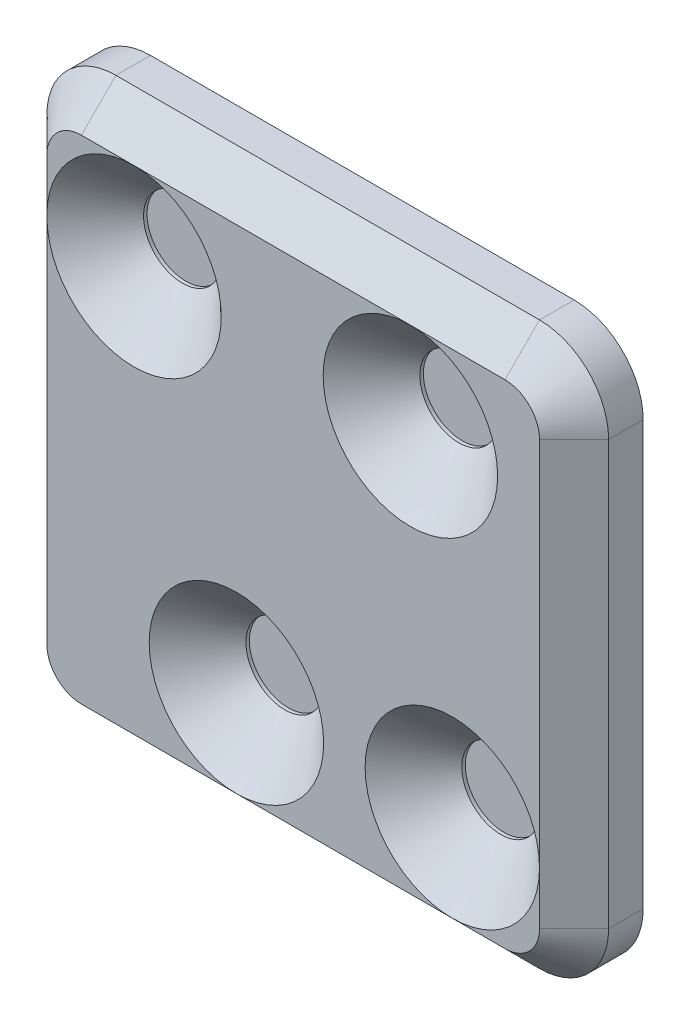
ISO-10303-21;
HEADER;
FILE_DESCRIPTION(('STEP AP214'),'2;1');
FILE_NAME('part.step','',(''),(''),'','','');
FILE_SCHEMA(('AUTOMOTIVE_DESIGN { 1 0 10303 214 1 1 1 1 }'));
ENDSEC;
DATA;
#1=APPLICATION_CONTEXT('core data for automotive mechanical design processes');
#2=APPLICATION_PROTOCOL_DEFINITION('international standard','automotive_design',2000,#1);
#3=PRODUCT_CONTEXT('',#1,'mechanical');
#4=PRODUCT('Part','Part','',(#3));
#5=PRODUCT_RELATED_PRODUCT_CATEGORY('part','',(#4));
#6=PRODUCT_DEFINITION_FORMATION('','',#4);
#7=PRODUCT_DEFINITION_CONTEXT('part definition',#1,'design');
#8=PRODUCT_DEFINITION('design','',#6,#7);
#9=PRODUCT_DEFINITION_SHAPE('','',#8);
#10=(LENGTH_UNIT() NAMED_UNIT(*) SI_UNIT(.MILLI.,.METRE.));
#11=(NAMED_UNIT(*) PLANE_ANGLE_UNIT() SI_UNIT($,.RADIAN.));
#12=(NAMED_UNIT(*) SI_UNIT($,.STERADIAN.) SOLID_ANGLE_UNIT());
#13=UNCERTAINTY_MEASURE_WITH_UNIT(LENGTH_MEASURE(1.E-05),#10,'distance_accuracy_value','');
#14=(GEOMETRIC_REPRESENTATION_CONTEXT(3) GLOBAL_UNCERTAINTY_ASSIGNED_CONTEXT((#13)) GLOBAL_UNIT_ASSIGNED_CONTEXT((#10,
#11,#12)) REPRESENTATION_CONTEXT('',''));
#15=CARTESIAN_POINT('',(0.,0.,0.));
#16=DIRECTION('',(0.,0.,1.));
#17=DIRECTION('',(1.,0.,0.));
#18=AXIS2_PLACEMENT_3D('',#15,#16,#17);
#19=CARTESIAN_POINT('',(0.,0.,4.));
#20=DIRECTION('',(0.,0.,1.));
#21=DIRECTION('',(1.,0.,0.));
#22=AXIS2_PLACEMENT_3D('',#19,#20,#21);
#23=PLANE('',#22);
#24=DIRECTION('',(0.,1.,0.));
#25=VECTOR('',#24,1.);
#26=CARTESIAN_POINT('',(14.2634559672906,12.2634559672906,4.));
#27=LINE('',#26,#25);
#28=CARTESIAN_POINT('',(14.2634559672906,-12.2634559672906,4.));
#29=VERTEX_POINT('',#28);
#30=CARTESIAN_POINT('',(14.2634559672906,-9.21345596729061,4.));
#31=VERTEX_POINT('',#30);
#32=EDGE_CURVE('E213',#29,#31,#27,.T.);
#33=ORIENTED_EDGE('',*,*,#32,.T.);
#34=CARTESIAN_POINT('',(9.21345596729061,-9.21345596729061,4.));
#35=DIRECTION('',(0.,0.,1.));
#36=DIRECTION('',(1.,0.,0.));
#37=AXIS2_PLACEMENT_3D('',#34,#35,#36);
#38=CIRCLE('',#37,5.05000000000002);
#39=CARTESIAN_POINT('',(9.21345596729061,-14.2634559672906,4.));
#40=VERTEX_POINT('',#39);
#41=EDGE_CURVE('E271',#31,#40,#38,.F.);
#42=ORIENTED_EDGE('',*,*,#41,.T.);
#43=DIRECTION('',(1.,0.,0.));
#44=VECTOR('',#43,1.);
#45=CARTESIAN_POINT('',(12.2634559672906,-14.2634559672906,4.));
#46=LINE('',#45,#44);
#47=CARTESIAN_POINT('',(12.2634559672906,-14.2634559672906,4.));
#48=VERTEX_POINT('',#47);
#49=EDGE_CURVE('E220',#40,#48,#46,.T.);
#50=ORIENTED_EDGE('',*,*,#49,.T.);
#51=CARTESIAN_POINT('',(12.2634559672906,-12.2634559672906,4.));
#52=DIRECTION('',(0.,0.,1.));
#53=DIRECTION('',(1.,0.,0.));
#54=AXIS2_PLACEMENT_3D('',#51,#52,#53);
#55=CIRCLE('',#54,2.00000000000001);
#56=EDGE_CURVE('E218',#48,#29,#55,.T.);
#57=ORIENTED_EDGE('',*,*,#56,.T.);
#58=EDGE_LOOP('',(#33,#42,#50,#57));
#59=FACE_BOUND('',#58,.T.);
#60=ADVANCED_FACE('F36',(#59),#23,.T.);
#61=DIRECTION('',(0.,-1.,0.));
#62=VECTOR('',#61,1.);
#63=CARTESIAN_POINT('',(-14.2634559672906,-12.2634559672906,4.));
#64=LINE('',#63,#62);
#65=CARTESIAN_POINT('',(-14.2634559672906,12.2634559672906,4.));
#66=VERTEX_POINT('',#65);
#67=CARTESIAN_POINT('',(-14.2634559672906,9.21345596729061,4.));
#68=VERTEX_POINT('',#67);
#69=EDGE_CURVE('E209',#66,#68,#64,.T.);
#70=ORIENTED_EDGE('',*,*,#69,.T.);
#71=CARTESIAN_POINT('',(-9.21345596729061,9.21345596729061,4.));
#72=DIRECTION('',(0.,0.,1.));
#73=DIRECTION('',(1.,0.,0.));
#74=AXIS2_PLACEMENT_3D('',#71,#72,#73);
#75=CIRCLE('',#74,5.05000000000001);
#76=CARTESIAN_POINT('',(-9.21345596729061,14.2634559672906,4.));
#77=VERTEX_POINT('',#76);
#78=EDGE_CURVE('E267',#68,#77,#75,.F.);
#79=ORIENTED_EDGE('',*,*,#78,.T.);
#80=DIRECTION('',(-1.,0.,0.));
#81=VECTOR('',#80,1.);
#82=CARTESIAN_POINT('',(-12.2634559672906,14.2634559672906,4.));
#83=LINE('',#82,#81);
#84=CARTESIAN_POINT('',(-12.2634559672906,14.2634559672906,4.));
#85=VERTEX_POINT('',#84);
#86=EDGE_CURVE('E199',#77,#85,#83,.T.);
#87=ORIENTED_EDGE('',*,*,#86,.T.);
#88=CARTESIAN_POINT('',(-12.2634559672906,12.2634559672906,4.));
#89=DIRECTION('',(0.,0.,1.));
#90=DIRECTION('',(1.,0.,0.));
#91=AXIS2_PLACEMENT_3D('',#88,#89,#90);
#92=CIRCLE('',#91,2.00000000000001);
#93=EDGE_CURVE('E203',#85,#66,#92,.T.);
#94=ORIENTED_EDGE('',*,*,#93,.T.);
#95=EDGE_LOOP('',(#70,#79,#87,#94));
#96=FACE_BOUND('',#95,.T.);
#97=ADVANCED_FACE('F300',(#96),#23,.T.);
#98=CARTESIAN_POINT('',(-16.2634559672906,-16.2634559672906,4.));
#99=DIRECTION('',(1.,0.,0.));
#100=DIRECTION('',(0.,0.,-1.));
#101=AXIS2_PLACEMENT_3D('',#98,#99,#100);
#102=PLANE('',#101);
#103=DIRECTION('',(0.,0.,-1.));
#104=VECTOR('',#103,1.);
#105=CARTESIAN_POINT('',(-16.2634559672906,-12.2634559672906,4.));
#106=LINE('',#105,#104);
#107=CARTESIAN_POINT('',(-16.2634559672906,-12.2634559672906,0.));
#108=VERTEX_POINT('',#107);
#109=CARTESIAN_POINT('',(-16.2634559672906,-12.2634559672906,2.));
#110=VERTEX_POINT('',#109);
#111=EDGE_CURVE('E160',#108,#110,#106,.F.);
#112=ORIENTED_EDGE('',*,*,#111,.T.);
#113=DIRECTION('',(0.,1.,0.));
#114=VECTOR('',#113,1.);
#115=CARTESIAN_POINT('',(-16.2634559672906,12.2634559672906,2.));
#116=LINE('',#115,#114);
#117=CARTESIAN_POINT('',(-16.2634559672906,12.2634559672906,2.));
#118=VERTEX_POINT('',#117);
#119=EDGE_CURVE('E232',#110,#118,#116,.T.);
#120=ORIENTED_EDGE('',*,*,#119,.T.);
#121=DIRECTION('',(0.,0.,-1.));
#122=VECTOR('',#121,1.);
#123=CARTESIAN_POINT('',(-16.2634559672906,12.2634559672906,4.));
#124=LINE('',#123,#122);
#125=CARTESIAN_POINT('',(-16.2634559672906,12.2634559672906,0.));
#126=VERTEX_POINT('',#125);
#127=EDGE_CURVE('E164',#118,#126,#124,.T.);
#128=ORIENTED_EDGE('',*,*,#127,.T.);
#129=DIRECTION('',(0.,-1.,0.));
#130=VECTOR('',#129,1.);
#131=CARTESIAN_POINT('',(-16.2634559672906,-16.2634559672906,0.));
#132=LINE('',#131,#130);
#133=EDGE_CURVE('E171',#126,#108,#132,.T.);
#134=ORIENTED_EDGE('',*,*,#133,.T.);
#135=EDGE_LOOP('',(#112,#120,#128,#134));
#136=FACE_BOUND('',#135,.T.);
#137=ADVANCED_FACE('F307',(#136),#102,.F.);
#138=CARTESIAN_POINT('',(16.2634559672906,-16.2634559672906,4.));
#139=DIRECTION('',(0.,1.,0.));
#140=DIRECTION('',(-1.,0.,0.));
#141=AXIS2_PLACEMENT_3D('',#138,#139,#140);
#142=PLANE('',#141);
#143=DIRECTION('',(0.,0.,-1.));
#144=VECTOR('',#143,1.);
#145=CARTESIAN_POINT('',(12.2634559672906,-16.2634559672906,4.));
#146=LINE('',#145,#144);
#147=CARTESIAN_POINT('',(12.2634559672906,-16.2634559672906,0.));
#148=VERTEX_POINT('',#147);
#149=CARTESIAN_POINT('',(12.2634559672906,-16.2634559672906,2.));
#150=VERTEX_POINT('',#149);
#151=EDGE_CURVE('E154',#148,#150,#146,.F.);
#152=ORIENTED_EDGE('',*,*,#151,.T.);
#153=DIRECTION('',(-1.,0.,0.));
#154=VECTOR('',#153,1.);
#155=CARTESIAN_POINT('',(-12.2634559672906,-16.2634559672906,2.));
#156=LINE('',#155,#154);
#157=CARTESIAN_POINT('',(-12.2634559672906,-16.2634559672906,2.));
#158=VERTEX_POINT('',#157);
#159=EDGE_CURVE('E151',#150,#158,#156,.T.);
#160=ORIENTED_EDGE('',*,*,#159,.T.);
#161=DIRECTION('',(0.,0.,-1.));
#162=VECTOR('',#161,1.);
#163=CARTESIAN_POINT('',(-12.2634559672906,-16.2634559672906,4.));
#164=LINE('',#163,#162);
#165=CARTESIAN_POINT('',(-12.2634559672906,-16.2634559672906,0.));
#166=VERTEX_POINT('',#165);
#167=EDGE_CURVE('E143',#158,#166,#164,.T.);
#168=ORIENTED_EDGE('',*,*,#167,.T.);
#169=DIRECTION('',(1.,0.,0.));
#170=VECTOR('',#169,1.);
#171=CARTESIAN_POINT('',(16.2634559672906,-16.2634559672906,0.));
#172=LINE('',#171,#170);
#173=EDGE_CURVE('E148',#166,#148,#172,.T.);
#174=ORIENTED_EDGE('',*,*,#173,.T.);
#175=EDGE_LOOP('',(#152,#160,#168,#174));
#176=FACE_BOUND('',#175,.T.);
#177=ADVANCED_FACE('F146',(#176),#142,.F.);
#178=CARTESIAN_POINT('',(16.2634559672906,-16.2634559672906,4.));
#179=DIRECTION('',(-1.,0.,0.));
#180=DIRECTION('',(0.,0.,1.));
#181=AXIS2_PLACEMENT_3D('',#178,#179,#180);
#182=PLANE('',#181);
#183=DIRECTION('',(0.,0.,-1.));
#184=VECTOR('',#183,1.);
#185=CARTESIAN_POINT('',(16.2634559672906,12.2634559672906,4.));
#186=LINE('',#185,#184);
#187=CARTESIAN_POINT('',(16.2634559672906,12.2634559672906,0.));
#188=VERTEX_POINT('',#187);
#189=CARTESIAN_POINT('',(16.2634559672906,12.2634559672906,2.));
#190=VERTEX_POINT('',#189);
#191=EDGE_CURVE('E189',#188,#190,#186,.F.);
#192=ORIENTED_EDGE('',*,*,#191,.T.);
#193=DIRECTION('',(0.,-1.,0.));
#194=VECTOR('',#193,1.);
#195=CARTESIAN_POINT('',(16.2634559672906,-12.2634559672906,2.));
#196=LINE('',#195,#194);
#197=CARTESIAN_POINT('',(16.2634559672906,-12.2634559672906,2.));
#198=VERTEX_POINT('',#197);
#199=EDGE_CURVE('E230',#190,#198,#196,.T.);
#200=ORIENTED_EDGE('',*,*,#199,.T.);
#201=DIRECTION('',(0.,0.,-1.));
#202=VECTOR('',#201,1.);
#203=CARTESIAN_POINT('',(16.2634559672906,-12.2634559672906,4.));
#204=LINE('',#203,#202);
#205=CARTESIAN_POINT('',(16.2634559672906,-12.2634559672906,0.));
#206=VERTEX_POINT('',#205);
#207=EDGE_CURVE('E192',#198,#206,#204,.T.);
#208=ORIENTED_EDGE('',*,*,#207,.T.);
#209=DIRECTION('',(0.,1.,0.));
#210=VECTOR('',#209,1.);
#211=CARTESIAN_POINT('',(16.2634559672906,-16.2634559672906,0.));
#212=LINE('',#211,#210);
#213=EDGE_CURVE('E170',#206,#188,#212,.T.);
#214=ORIENTED_EDGE('',*,*,#213,.T.);
#215=EDGE_LOOP('',(#192,#200,#208,#214));
#216=FACE_BOUND('',#215,.T.);
#217=ADVANCED_FACE('F317',(#216),#182,.F.);
#218=CARTESIAN_POINT('',(16.2634559672906,16.2634559672906,4.));
#219=DIRECTION('',(0.,-1.,0.));
#220=DIRECTION('',(1.,0.,0.));
#221=AXIS2_PLACEMENT_3D('',#218,#219,#220);
#222=PLANE('',#221);
#223=DIRECTION('',(0.,0.,-1.));
#224=VECTOR('',#223,1.);
#225=CARTESIAN_POINT('',(-12.2634559672906,16.2634559672906,4.));
#226=LINE('',#225,#224);
#227=CARTESIAN_POINT('',(-12.2634559672906,16.2634559672906,0.));
#228=VERTEX_POINT('',#227);
#229=CARTESIAN_POINT('',(-12.2634559672906,16.2634559672906,2.));
#230=VERTEX_POINT('',#229);
#231=EDGE_CURVE('E194',#228,#230,#226,.F.);
#232=ORIENTED_EDGE('',*,*,#231,.T.);
#233=DIRECTION('',(1.,0.,0.));
#234=VECTOR('',#233,1.);
#235=CARTESIAN_POINT('',(12.2634559672906,16.2634559672906,2.));
#236=LINE('',#235,#234);
#237=CARTESIAN_POINT('',(12.2634559672906,16.2634559672906,2.));
#238=VERTEX_POINT('',#237);
#239=EDGE_CURVE('E238',#230,#238,#236,.T.);
#240=ORIENTED_EDGE('',*,*,#239,.T.);
#241=DIRECTION('',(0.,0.,-1.));
#242=VECTOR('',#241,1.);
#243=CARTESIAN_POINT('',(12.2634559672906,16.2634559672906,4.));
#244=LINE('',#243,#242);
#245=CARTESIAN_POINT('',(12.2634559672906,16.2634559672906,0.));
#246=VERTEX_POINT('',#245);
#247=EDGE_CURVE('E197',#238,#246,#244,.T.);
#248=ORIENTED_EDGE('',*,*,#247,.T.);
#249=DIRECTION('',(-1.,0.,0.));
#250=VECTOR('',#249,1.);
#251=CARTESIAN_POINT('',(16.2634559672906,16.2634559672906,0.));
#252=LINE('',#251,#250);
#253=EDGE_CURVE('E174',#246,#228,#252,.T.);
#254=ORIENTED_EDGE('',*,*,#253,.T.);
#255=EDGE_LOOP('',(#232,#240,#248,#254));
#256=FACE_BOUND('',#255,.T.);
#257=ADVANCED_FACE('F312',(#256),#222,.F.);
#258=CARTESIAN_POINT('',(12.2634559672906,14.2634559672906,4.));
#259=VERTEX_POINT('',#258);
#260=CARTESIAN_POINT('',(6.78654403270939,14.2634559672906,4.));
#261=VERTEX_POINT('',#260);
#262=EDGE_CURVE('E200',#259,#261,#83,.T.);
#263=ORIENTED_EDGE('',*,*,#262,.T.);
#264=CARTESIAN_POINT('',(6.78654403270939,9.21345596729061,4.));
#265=DIRECTION('',(0.,0.,1.));
#266=DIRECTION('',(1.,0.,0.));
#267=AXIS2_PLACEMENT_3D('',#264,#265,#266);
#268=CIRCLE('',#267,5.05000000000001);
#269=EDGE_CURVE('E277',#261,#261,#268,.F.);
#270=ORIENTED_EDGE('',*,*,#269,.T.);
#271=EDGE_CURVE('E204',#261,#77,#83,.T.);
#272=ORIENTED_EDGE('',*,*,#271,.T.);
#273=CARTESIAN_POINT('',(-9.21345596729061,9.21345596729061,4.));
#274=DIRECTION('',(0.,0.,1.));
#275=DIRECTION('',(1.,0.,0.));
#276=AXIS2_PLACEMENT_3D('',#273,#274,#275);
#277=CIRCLE('',#276,5.05000000000001);
#278=EDGE_CURVE('E51',#77,#68,#277,.F.);
#279=ORIENTED_EDGE('',*,*,#278,.T.);
#280=CARTESIAN_POINT('',(-14.2634559672906,-12.2634559672906,4.));
#281=VERTEX_POINT('',#280);
#282=EDGE_CURVE('E208',#68,#281,#64,.T.);
#283=ORIENTED_EDGE('',*,*,#282,.T.);
#284=CARTESIAN_POINT('',(-12.2634559672906,-12.2634559672906,4.));
#285=DIRECTION('',(0.,0.,1.));
#286=DIRECTION('',(1.,0.,0.));
#287=AXIS2_PLACEMENT_3D('',#284,#285,#286);
#288=CIRCLE('',#287,2.00000000000001);
#289=CARTESIAN_POINT('',(-12.2634559672906,-14.2634559672906,4.));
#290=VERTEX_POINT('',#289);
#291=EDGE_CURVE('E216',#281,#290,#288,.T.);
#292=ORIENTED_EDGE('',*,*,#291,.T.);
#293=CARTESIAN_POINT('',(-3.28654403270939,-14.2634559672906,4.));
#294=VERTEX_POINT('',#293);
#295=EDGE_CURVE('E221',#290,#294,#46,.T.);
#296=ORIENTED_EDGE('',*,*,#295,.T.);
#297=CARTESIAN_POINT('',(-3.28654403270939,-9.21345596729061,4.));
#298=DIRECTION('',(0.,0.,1.));
#299=DIRECTION('',(1.,0.,0.));
#300=AXIS2_PLACEMENT_3D('',#297,#298,#299);
#301=CIRCLE('',#300,5.05000000000001);
#302=EDGE_CURVE('E274',#294,#294,#301,.F.);
#303=ORIENTED_EDGE('',*,*,#302,.T.);
#304=EDGE_CURVE('E224',#294,#40,#46,.T.);
#305=ORIENTED_EDGE('',*,*,#304,.T.);
#306=CARTESIAN_POINT('',(9.21345596729061,-9.21345596729061,4.));
#307=DIRECTION('',(0.,0.,1.));
#308=DIRECTION('',(1.,0.,0.));
#309=AXIS2_PLACEMENT_3D('',#306,#307,#308);
#310=CIRCLE('',#309,5.05000000000002);
#311=EDGE_CURVE('E269',#40,#31,#310,.F.);
#312=ORIENTED_EDGE('',*,*,#311,.T.);
#313=CARTESIAN_POINT('',(14.2634559672906,12.2634559672906,4.));
#314=VERTEX_POINT('',#313);
#315=EDGE_CURVE('E212',#31,#314,#27,.T.);
#316=ORIENTED_EDGE('',*,*,#315,.T.);
#317=CARTESIAN_POINT('',(12.2634559672906,12.2634559672906,4.));
#318=DIRECTION('',(0.,0.,1.));
#319=DIRECTION('',(1.,0.,0.));
#320=AXIS2_PLACEMENT_3D('',#317,#318,#319);
#321=CIRCLE('',#320,2.00000000000001);
#322=EDGE_CURVE('E206',#314,#259,#321,.T.);
#323=ORIENTED_EDGE('',*,*,#322,.T.);
#324=EDGE_LOOP('',(#263,#270,#272,#279,#283,#292,#296,#303,#305,#312,#316,#323));
#325=FACE_BOUND('',#324,.T.);
#326=ADVANCED_FACE('F303',(#325),#23,.T.);
#327=CARTESIAN_POINT('',(0.,0.,0.));
#328=DIRECTION('',(0.,0.,1.));
#329=DIRECTION('',(1.,0.,0.));
#330=AXIS2_PLACEMENT_3D('',#327,#328,#329);
#331=PLANE('',#330);
#332=ORIENTED_EDGE('',*,*,#173,.F.);
#333=CARTESIAN_POINT('',(-12.2634559672906,-12.2634559672906,0.));
#334=DIRECTION('',(0.,0.,1.));
#335=DIRECTION('',(1.,0.,0.));
#336=AXIS2_PLACEMENT_3D('',#333,#334,#335);
#337=CIRCLE('',#336,4.);
#338=EDGE_CURVE('E157',#166,#108,#337,.F.);
#339=ORIENTED_EDGE('',*,*,#338,.T.);
#340=ORIENTED_EDGE('',*,*,#133,.F.);
#341=CARTESIAN_POINT('',(-12.2634559672906,12.2634559672906,0.));
#342=DIRECTION('',(0.,0.,1.));
#343=DIRECTION('',(1.,0.,0.));
#344=AXIS2_PLACEMENT_3D('',#341,#342,#343);
#345=CIRCLE('',#344,4.);
#346=EDGE_CURVE('E153',#126,#228,#345,.F.);
#347=ORIENTED_EDGE('',*,*,#346,.T.);
#348=ORIENTED_EDGE('',*,*,#253,.F.);
#349=CARTESIAN_POINT('',(12.2634559672906,12.2634559672906,0.));
#350=DIRECTION('',(0.,0.,1.));
#351=DIRECTION('',(1.,0.,0.));
#352=AXIS2_PLACEMENT_3D('',#349,#350,#351);
#353=CIRCLE('',#352,4.);
#354=EDGE_CURVE('E184',#246,#188,#353,.F.);
#355=ORIENTED_EDGE('',*,*,#354,.T.);
#356=ORIENTED_EDGE('',*,*,#213,.F.);
#357=CARTESIAN_POINT('',(12.2634559672906,-12.2634559672906,0.));
#358=DIRECTION('',(0.,0.,1.));
#359=DIRECTION('',(1.,0.,0.));
#360=AXIS2_PLACEMENT_3D('',#357,#358,#359);
#361=CIRCLE('',#360,4.);
#362=EDGE_CURVE('E165',#206,#148,#361,.F.);
#363=ORIENTED_EDGE('',*,*,#362,.T.);
#364=EDGE_LOOP('',(#332,#339,#340,#347,#348,#355,#356,#363));
#365=FACE_BOUND('',#364,.T.);
#366=ADVANCED_FACE('F167',(#365),#331,.F.);
#367=CARTESIAN_POINT('',(-12.2634559672906,-12.2634559672906,4.));
#368=DIRECTION('',(0.,0.,-1.));
#369=DIRECTION('',(-1.,0.,0.));
#370=AXIS2_PLACEMENT_3D('',#367,#368,#369);
#371=CYLINDRICAL_SURFACE('',#370,4.);
#372=ORIENTED_EDGE('',*,*,#167,.F.);
#373=CARTESIAN_POINT('',(-12.2634559672906,-12.2634559672906,2.));
#374=DIRECTION('',(0.,0.,1.));
#375=DIRECTION('',(1.,0.,0.));
#376=AXIS2_PLACEMENT_3D('',#373,#374,#375);
#377=CIRCLE('',#376,4.);
#378=EDGE_CURVE('E228',#158,#110,#377,.F.);
#379=ORIENTED_EDGE('',*,*,#378,.T.);
#380=ORIENTED_EDGE('',*,*,#111,.F.);
#381=ORIENTED_EDGE('',*,*,#338,.F.);
#382=EDGE_LOOP('',(#372,#379,#380,#381));
#383=FACE_BOUND('',#382,.T.);
#384=ADVANCED_FACE('F158',(#383),#371,.T.);
#385=CARTESIAN_POINT('',(12.2634559672906,-12.2634559672906,4.));
#386=DIRECTION('',(0.,0.,-1.));
#387=DIRECTION('',(-1.,0.,0.));
#388=AXIS2_PLACEMENT_3D('',#385,#386,#387);
#389=CYLINDRICAL_SURFACE('',#388,4.);
#390=ORIENTED_EDGE('',*,*,#207,.F.);
#391=CARTESIAN_POINT('',(12.2634559672906,-12.2634559672906,2.));
#392=DIRECTION('',(0.,0.,1.));
#393=DIRECTION('',(1.,0.,0.));
#394=AXIS2_PLACEMENT_3D('',#391,#392,#393);
#395=CIRCLE('',#394,4.);
#396=EDGE_CURVE('E226',#198,#150,#395,.F.);
#397=ORIENTED_EDGE('',*,*,#396,.T.);
#398=ORIENTED_EDGE('',*,*,#151,.F.);
#399=ORIENTED_EDGE('',*,*,#362,.F.);
#400=EDGE_LOOP('',(#390,#397,#398,#399));
#401=FACE_BOUND('',#400,.T.);
#402=ADVANCED_FACE('F441',(#401),#389,.T.);
#403=CARTESIAN_POINT('',(12.2634559672906,12.2634559672906,4.));
#404=DIRECTION('',(0.,0.,-1.));
#405=DIRECTION('',(-1.,0.,0.));
#406=AXIS2_PLACEMENT_3D('',#403,#404,#405);
#407=CYLINDRICAL_SURFACE('',#406,4.);
#408=ORIENTED_EDGE('',*,*,#247,.F.);
#409=CARTESIAN_POINT('',(12.2634559672906,12.2634559672906,2.));
#410=DIRECTION('',(0.,0.,1.));
#411=DIRECTION('',(1.,0.,0.));
#412=AXIS2_PLACEMENT_3D('',#409,#410,#411);
#413=CIRCLE('',#412,4.);
#414=EDGE_CURVE('E234',#238,#190,#413,.F.);
#415=ORIENTED_EDGE('',*,*,#414,.T.);
#416=ORIENTED_EDGE('',*,*,#191,.F.);
#417=ORIENTED_EDGE('',*,*,#354,.F.);
#418=EDGE_LOOP('',(#408,#415,#416,#417));
#419=FACE_BOUND('',#418,.T.);
#420=ADVANCED_FACE('F336',(#419),#407,.T.);
#421=CARTESIAN_POINT('',(-12.2634559672906,12.2634559672906,4.));
#422=DIRECTION('',(0.,0.,-1.));
#423=DIRECTION('',(-1.,0.,0.));
#424=AXIS2_PLACEMENT_3D('',#421,#422,#423);
#425=CYLINDRICAL_SURFACE('',#424,4.);
#426=ORIENTED_EDGE('',*,*,#127,.F.);
#427=CARTESIAN_POINT('',(-12.2634559672906,12.2634559672906,2.));
#428=DIRECTION('',(0.,0.,1.));
#429=DIRECTION('',(1.,0.,0.));
#430=AXIS2_PLACEMENT_3D('',#427,#428,#429);
#431=CIRCLE('',#430,4.);
#432=EDGE_CURVE('E236',#118,#230,#431,.F.);
#433=ORIENTED_EDGE('',*,*,#432,.T.);
#434=ORIENTED_EDGE('',*,*,#231,.F.);
#435=ORIENTED_EDGE('',*,*,#346,.F.);
#436=EDGE_LOOP('',(#426,#433,#434,#435));
#437=FACE_BOUND('',#436,.T.);
#438=ADVANCED_FACE('F345',(#437),#425,.T.);
#439=CARTESIAN_POINT('',(0.,14.2634559672906,4.));
#440=DIRECTION('',(0.,0.70710678118655,0.707106781186545));
#441=DIRECTION('',(1.,0.,0.));
#442=AXIS2_PLACEMENT_3D('',#439,#440,#441);
#443=PLANE('',#442);
#444=DIRECTION('',(0.,-0.707106781186545,0.70710678118655));
#445=VECTOR('',#444,1.);
#446=CARTESIAN_POINT('',(12.2634559672906,16.2634559672906,2.));
#447=LINE('',#446,#445);
#448=EDGE_CURVE('E259',#238,#259,#447,.T.);
#449=ORIENTED_EDGE('',*,*,#448,.F.);
#450=ORIENTED_EDGE('',*,*,#239,.F.);
#451=DIRECTION('',(0.,0.707106781186545,-0.70710678118655));
#452=VECTOR('',#451,1.);
#453=CARTESIAN_POINT('',(-12.2634559672906,14.2634559672906,4.));
#454=LINE('',#453,#452);
#455=EDGE_CURVE('E176',#85,#230,#454,.T.);
#456=ORIENTED_EDGE('',*,*,#455,.F.);
#457=ORIENTED_EDGE('',*,*,#86,.F.);
#458=ORIENTED_EDGE('',*,*,#271,.F.);
#459=ORIENTED_EDGE('',*,*,#262,.F.);
#460=EDGE_LOOP('',(#449,#450,#456,#457,#458,#459));
#461=FACE_BOUND('',#460,.T.);
#462=ADVANCED_FACE('F325',(#461),#443,.T.);
#463=CARTESIAN_POINT('',(-12.2634559672906,12.2634559672906,4.));
#464=DIRECTION('',(0.,0.,-1.));
#465=DIRECTION('',(-1.,0.,0.));
#466=AXIS2_PLACEMENT_3D('',#463,#464,#465);
#467=CONICAL_SURFACE('',#466,2.00000000000001,0.785398163397445);
#468=ORIENTED_EDGE('',*,*,#455,.T.);
#469=ORIENTED_EDGE('',*,*,#432,.F.);
#470=DIRECTION('',(-0.707106781186545,0.,-0.70710678118655));
#471=VECTOR('',#470,1.);
#472=CARTESIAN_POINT('',(-14.2634559672906,12.2634559672906,4.));
#473=LINE('',#472,#471);
#474=EDGE_CURVE('E256',#66,#118,#473,.T.);
#475=ORIENTED_EDGE('',*,*,#474,.F.);
#476=ORIENTED_EDGE('',*,*,#93,.F.);
#477=EDGE_LOOP('',(#468,#469,#475,#476));
#478=FACE_BOUND('',#477,.T.);
#479=ADVANCED_FACE('F349',(#478),#467,.T.);
#480=CARTESIAN_POINT('',(12.2634559672906,12.2634559672906,4.));
#481=DIRECTION('',(0.,0.,-1.));
#482=DIRECTION('',(-1.,0.,0.));
#483=AXIS2_PLACEMENT_3D('',#480,#481,#482);
#484=CONICAL_SURFACE('',#483,2.00000000000001,0.785398163397445);
#485=ORIENTED_EDGE('',*,*,#448,.T.);
#486=ORIENTED_EDGE('',*,*,#322,.F.);
#487=DIRECTION('',(-0.707106781186545,0.,0.70710678118655));
#488=VECTOR('',#487,1.);
#489=CARTESIAN_POINT('',(16.2634559672906,12.2634559672906,2.));
#490=LINE('',#489,#488);
#491=EDGE_CURVE('E253',#190,#314,#490,.T.);
#492=ORIENTED_EDGE('',*,*,#491,.F.);
#493=ORIENTED_EDGE('',*,*,#414,.F.);
#494=EDGE_LOOP('',(#485,#486,#492,#493));
#495=FACE_BOUND('',#494,.T.);
#496=ADVANCED_FACE('F330',(#495),#484,.T.);
#497=CARTESIAN_POINT('',(-14.2634559672906,0.,4.));
#498=DIRECTION('',(-0.70710678118655,0.,0.707106781186545));
#499=DIRECTION('',(0.,1.,0.));
#500=AXIS2_PLACEMENT_3D('',#497,#498,#499);
#501=PLANE('',#500);
#502=ORIENTED_EDGE('',*,*,#474,.T.);
#503=ORIENTED_EDGE('',*,*,#119,.F.);
#504=DIRECTION('',(-0.707106781186545,0.,-0.70710678118655));
#505=VECTOR('',#504,1.);
#506=CARTESIAN_POINT('',(-14.2634559672906,-12.2634559672906,4.));
#507=LINE('',#506,#505);
#508=EDGE_CURVE('E250',#281,#110,#507,.T.);
#509=ORIENTED_EDGE('',*,*,#508,.F.);
#510=ORIENTED_EDGE('',*,*,#282,.F.);
#511=ORIENTED_EDGE('',*,*,#69,.F.);
#512=EDGE_LOOP('',(#502,#503,#509,#510,#511));
#513=FACE_BOUND('',#512,.T.);
#514=ADVANCED_FACE('F355',(#513),#501,.T.);
#515=CARTESIAN_POINT('',(14.2634559672906,0.,4.));
#516=DIRECTION('',(0.70710678118655,0.,0.707106781186545));
#517=DIRECTION('',(0.,-1.,0.));
#518=AXIS2_PLACEMENT_3D('',#515,#516,#517);
#519=PLANE('',#518);
#520=ORIENTED_EDGE('',*,*,#491,.T.);
#521=ORIENTED_EDGE('',*,*,#315,.F.);
#522=ORIENTED_EDGE('',*,*,#32,.F.);
#523=DIRECTION('',(-0.707106781186545,0.,0.70710678118655));
#524=VECTOR('',#523,1.);
#525=CARTESIAN_POINT('',(16.2634559672906,-12.2634559672906,2.));
#526=LINE('',#525,#524);
#527=EDGE_CURVE('E247',#198,#29,#526,.T.);
#528=ORIENTED_EDGE('',*,*,#527,.F.);
#529=ORIENTED_EDGE('',*,*,#199,.F.);
#530=EDGE_LOOP('',(#520,#521,#522,#528,#529));
#531=FACE_BOUND('',#530,.T.);
#532=ADVANCED_FACE('F426',(#531),#519,.T.);
#533=CARTESIAN_POINT('',(-12.2634559672906,-12.2634559672906,4.));
#534=DIRECTION('',(0.,0.,-1.));
#535=DIRECTION('',(-1.,0.,0.));
#536=AXIS2_PLACEMENT_3D('',#533,#534,#535);
#537=CONICAL_SURFACE('',#536,2.00000000000001,0.785398163397445);
#538=ORIENTED_EDGE('',*,*,#508,.T.);
#539=ORIENTED_EDGE('',*,*,#378,.F.);
#540=DIRECTION('',(0.,-0.707106781186545,-0.70710678118655));
#541=VECTOR('',#540,1.);
#542=CARTESIAN_POINT('',(-12.2634559672906,-14.2634559672906,4.));
#543=LINE('',#542,#541);
#544=EDGE_CURVE('E244',#290,#158,#543,.T.);
#545=ORIENTED_EDGE('',*,*,#544,.F.);
#546=ORIENTED_EDGE('',*,*,#291,.F.);
#547=EDGE_LOOP('',(#538,#539,#545,#546));
#548=FACE_BOUND('',#547,.T.);
#549=ADVANCED_FACE('F429',(#548),#537,.T.);
#550=CARTESIAN_POINT('',(12.2634559672906,-12.2634559672906,4.));
#551=DIRECTION('',(0.,0.,-1.));
#552=DIRECTION('',(-1.,0.,0.));
#553=AXIS2_PLACEMENT_3D('',#550,#551,#552);
#554=CONICAL_SURFACE('',#553,2.00000000000001,0.785398163397445);
#555=ORIENTED_EDGE('',*,*,#527,.T.);
#556=ORIENTED_EDGE('',*,*,#56,.F.);
#557=DIRECTION('',(0.,0.707106781186545,0.70710678118655));
#558=VECTOR('',#557,1.);
#559=CARTESIAN_POINT('',(12.2634559672906,-16.2634559672906,2.));
#560=LINE('',#559,#558);
#561=EDGE_CURVE('E241',#150,#48,#560,.T.);
#562=ORIENTED_EDGE('',*,*,#561,.F.);
#563=ORIENTED_EDGE('',*,*,#396,.F.);
#564=EDGE_LOOP('',(#555,#556,#562,#563));
#565=FACE_BOUND('',#564,.T.);
#566=ADVANCED_FACE('F392',(#565),#554,.T.);
#567=CARTESIAN_POINT('',(0.,-14.2634559672906,4.));
#568=DIRECTION('',(0.,-0.70710678118655,0.707106781186545));
#569=DIRECTION('',(-1.,0.,0.));
#570=AXIS2_PLACEMENT_3D('',#567,#568,#569);
#571=PLANE('',#570);
#572=ORIENTED_EDGE('',*,*,#544,.T.);
#573=ORIENTED_EDGE('',*,*,#159,.F.);
#574=ORIENTED_EDGE('',*,*,#561,.T.);
#575=ORIENTED_EDGE('',*,*,#49,.F.);
#576=ORIENTED_EDGE('',*,*,#304,.F.);
#577=ORIENTED_EDGE('',*,*,#295,.F.);
#578=EDGE_LOOP('',(#572,#573,#574,#575,#576,#577));
#579=FACE_BOUND('',#578,.T.);
#580=ADVANCED_FACE('F384',(#579),#571,.T.);
#581=CARTESIAN_POINT('',(6.78654403270939,9.21345596729061,1.));
#582=DIRECTION('',(0.,0.,1.));
#583=DIRECTION('',(1.,0.,0.));
#584=AXIS2_PLACEMENT_3D('',#581,#582,#583);
#585=CYLINDRICAL_SURFACE('',#584,2.25);
#586=CARTESIAN_POINT('',(6.78654403270939,9.21345596729061,1.2));
#587=DIRECTION('',(0.,0.,1.));
#588=DIRECTION('',(1.,0.,0.));
#589=AXIS2_PLACEMENT_3D('',#586,#587,#588);
#590=CIRCLE('',#589,2.25);
#591=CARTESIAN_POINT('',(9.0365440327094,9.21345596729061,1.2));
#592=VERTEX_POINT('',#591);
#593=EDGE_CURVE('E240',#592,#592,#590,.T.);
#594=ORIENTED_EDGE('',*,*,#593,.T.);
#595=EDGE_LOOP('',(#594));
#596=FACE_BOUND('',#595,.T.);
#597=CARTESIAN_POINT('',(6.78654403270939,9.21345596729061,1.));
#598=DIRECTION('',(0.,0.,1.));
#599=DIRECTION('',(1.,0.,0.));
#600=AXIS2_PLACEMENT_3D('',#597,#598,#599);
#601=CIRCLE('',#600,2.25);
#602=CARTESIAN_POINT('',(9.0365440327094,9.21345596729061,1.));
#603=VERTEX_POINT('',#602);
#604=EDGE_CURVE('E376',#603,#603,#601,.T.);
#605=ORIENTED_EDGE('',*,*,#604,.F.);
#606=EDGE_LOOP('',(#605));
#607=FACE_BOUND('',#606,.T.);
#608=ADVANCED_FACE('F382',(#596,#607),#585,.F.);
#609=CARTESIAN_POINT('',(6.78654403270939,9.21345596729061,1.));
#610=DIRECTION('',(0.,0.,1.));
#611=DIRECTION('',(1.,0.,0.));
#612=AXIS2_PLACEMENT_3D('',#609,#610,#611);
#613=PLANE('',#612);
#614=ORIENTED_EDGE('',*,*,#604,.T.);
#615=EDGE_LOOP('',(#614));
#616=FACE_BOUND('',#615,.T.);
#617=ADVANCED_FACE('F380',(#616),#613,.T.);
#618=CARTESIAN_POINT('',(-3.28654403270939,-9.21345596729061,1.));
#619=DIRECTION('',(0.,0.,1.));
#620=DIRECTION('',(1.,0.,0.));
#621=AXIS2_PLACEMENT_3D('',#618,#619,#620);
#622=CYLINDRICAL_SURFACE('',#621,2.25);
#623=CARTESIAN_POINT('',(-3.28654403270939,-9.21345596729061,1.2));
#624=DIRECTION('',(0.,0.,1.));
#625=DIRECTION('',(1.,0.,0.));
#626=AXIS2_PLACEMENT_3D('',#623,#624,#625);
#627=CIRCLE('',#626,2.25);
#628=CARTESIAN_POINT('',(-1.03654403270939,-9.21345596729061,1.2));
#629=VERTEX_POINT('',#628);
#630=EDGE_CURVE('E280',#629,#629,#627,.T.);
#631=ORIENTED_EDGE('',*,*,#630,.T.);
#632=EDGE_LOOP('',(#631));
#633=FACE_BOUND('',#632,.T.);
#634=CARTESIAN_POINT('',(-3.28654403270939,-9.21345596729061,1.));
#635=DIRECTION('',(0.,0.,1.));
#636=DIRECTION('',(1.,0.,0.));
#637=AXIS2_PLACEMENT_3D('',#634,#635,#636);
#638=CIRCLE('',#637,2.25);
#639=CARTESIAN_POINT('',(-1.03654403270939,-9.21345596729061,1.));
#640=VERTEX_POINT('',#639);
#641=EDGE_CURVE('E372',#640,#640,#638,.T.);
#642=ORIENTED_EDGE('',*,*,#641,.F.);
#643=EDGE_LOOP('',(#642));
#644=FACE_BOUND('',#643,.T.);
#645=ADVANCED_FACE('F390',(#633,#644),#622,.F.);
#646=CARTESIAN_POINT('',(-3.28654403270939,-9.21345596729061,1.));
#647=DIRECTION('',(0.,0.,1.));
#648=DIRECTION('',(1.,0.,0.));
#649=AXIS2_PLACEMENT_3D('',#646,#647,#648);
#650=PLANE('',#649);
#651=ORIENTED_EDGE('',*,*,#641,.T.);
#652=EDGE_LOOP('',(#651));
#653=FACE_BOUND('',#652,.T.);
#654=ADVANCED_FACE('F398',(#653),#650,.T.);
#655=CARTESIAN_POINT('',(9.21345596729061,-9.21345596729061,1.));
#656=DIRECTION('',(0.,0.,1.));
#657=DIRECTION('',(1.,0.,0.));
#658=AXIS2_PLACEMENT_3D('',#655,#656,#657);
#659=CYLINDRICAL_SURFACE('',#658,2.25);
#660=CARTESIAN_POINT('',(9.21345596729061,-9.21345596729061,1.19999999999999));
#661=DIRECTION('',(0.,0.,1.));
#662=DIRECTION('',(1.,0.,0.));
#663=AXIS2_PLACEMENT_3D('',#660,#661,#662);
#664=CIRCLE('',#663,2.25);
#665=CARTESIAN_POINT('',(11.4634559672906,-9.21345596729061,1.19999999999999));
#666=VERTEX_POINT('',#665);
#667=EDGE_CURVE('E44',#666,#666,#664,.T.);
#668=ORIENTED_EDGE('',*,*,#667,.T.);
#669=EDGE_LOOP('',(#668));
#670=FACE_BOUND('',#669,.T.);
#671=CARTESIAN_POINT('',(9.21345596729061,-9.21345596729061,1.));
#672=DIRECTION('',(0.,0.,1.));
#673=DIRECTION('',(1.,0.,0.));
#674=AXIS2_PLACEMENT_3D('',#671,#672,#673);
#675=CIRCLE('',#674,2.25);
#676=CARTESIAN_POINT('',(11.4634559672906,-9.21345596729061,1.));
#677=VERTEX_POINT('',#676);
#678=EDGE_CURVE('E369',#677,#677,#675,.T.);
#679=ORIENTED_EDGE('',*,*,#678,.F.);
#680=EDGE_LOOP('',(#679));
#681=FACE_BOUND('',#680,.T.);
#682=ADVANCED_FACE('F285',(#670,#681),#659,.F.);
#683=CARTESIAN_POINT('',(9.21345596729061,-9.21345596729061,1.));
#684=DIRECTION('',(0.,0.,1.));
#685=DIRECTION('',(1.,0.,0.));
#686=AXIS2_PLACEMENT_3D('',#683,#684,#685);
#687=PLANE('',#686);
#688=ORIENTED_EDGE('',*,*,#678,.T.);
#689=EDGE_LOOP('',(#688));
#690=FACE_BOUND('',#689,.T.);
#691=ADVANCED_FACE('F364',(#690),#687,.T.);
#692=CARTESIAN_POINT('',(-9.21345596729061,9.21345596729061,1.));
#693=DIRECTION('',(0.,0.,1.));
#694=DIRECTION('',(1.,0.,0.));
#695=AXIS2_PLACEMENT_3D('',#692,#693,#694);
#696=CYLINDRICAL_SURFACE('',#695,2.25);
#697=CARTESIAN_POINT('',(-9.21345596729061,9.21345596729061,1.2));
#698=DIRECTION('',(0.,0.,1.));
#699=DIRECTION('',(1.,0.,0.));
#700=AXIS2_PLACEMENT_3D('',#697,#698,#699);
#701=CIRCLE('',#700,2.25);
#702=CARTESIAN_POINT('',(-6.96345596729061,9.21345596729061,1.2));
#703=VERTEX_POINT('',#702);
#704=EDGE_CURVE('E11',#703,#703,#701,.T.);
#705=ORIENTED_EDGE('',*,*,#704,.T.);
#706=EDGE_LOOP('',(#705));
#707=FACE_BOUND('',#706,.T.);
#708=CARTESIAN_POINT('',(-9.21345596729061,9.21345596729061,1.));
#709=DIRECTION('',(0.,0.,1.));
#710=DIRECTION('',(1.,0.,0.));
#711=AXIS2_PLACEMENT_3D('',#708,#709,#710);
#712=CIRCLE('',#711,2.25);
#713=CARTESIAN_POINT('',(-6.96345596729061,9.21345596729061,1.));
#714=VERTEX_POINT('',#713);
#715=EDGE_CURVE('E245',#714,#714,#712,.T.);
#716=ORIENTED_EDGE('',*,*,#715,.F.);
#717=EDGE_LOOP('',(#716));
#718=FACE_BOUND('',#717,.T.);
#719=ADVANCED_FACE('F360',(#707,#718),#696,.F.);
#720=CARTESIAN_POINT('',(-9.21345596729061,9.21345596729061,1.));
#721=DIRECTION('',(0.,0.,1.));
#722=DIRECTION('',(1.,0.,0.));
#723=AXIS2_PLACEMENT_3D('',#720,#721,#722);
#724=PLANE('',#723);
#725=ORIENTED_EDGE('',*,*,#715,.T.);
#726=EDGE_LOOP('',(#725));
#727=FACE_BOUND('',#726,.T.);
#728=ADVANCED_FACE('F363',(#727),#724,.T.);
#729=CARTESIAN_POINT('',(6.78654403270939,9.21345596729061,1.2));
#730=DIRECTION('',(0.,0.,1.));
#731=DIRECTION('',(1.,0.,0.));
#732=AXIS2_PLACEMENT_3D('',#729,#730,#731);
#733=CONICAL_SURFACE('',#732,2.25,0.785398163397451);
#734=ORIENTED_EDGE('',*,*,#269,.F.);
#735=EDGE_LOOP('',(#734));
#736=FACE_BOUND('',#735,.T.);
#737=ORIENTED_EDGE('',*,*,#593,.F.);
#738=EDGE_LOOP('',(#737));
#739=FACE_BOUND('',#738,.T.);
#740=ADVANCED_FACE('F296',(#736,#739),#733,.F.);
#741=CARTESIAN_POINT('',(-3.28654403270939,-9.21345596729061,1.2));
#742=DIRECTION('',(0.,0.,1.));
#743=DIRECTION('',(1.,0.,0.));
#744=AXIS2_PLACEMENT_3D('',#741,#742,#743);
#745=CONICAL_SURFACE('',#744,2.25,0.785398163397451);
#746=ORIENTED_EDGE('',*,*,#302,.F.);
#747=EDGE_LOOP('',(#746));
#748=FACE_BOUND('',#747,.T.);
#749=ORIENTED_EDGE('',*,*,#630,.F.);
#750=EDGE_LOOP('',(#749));
#751=FACE_BOUND('',#750,.T.);
#752=ADVANCED_FACE('F290',(#748,#751),#745,.F.);
#753=CARTESIAN_POINT('',(9.21345596729061,-9.21345596729061,1.19999999999999));
#754=DIRECTION('',(0.,0.,1.));
#755=DIRECTION('',(1.,0.,0.));
#756=AXIS2_PLACEMENT_3D('',#753,#754,#755);
#757=CONICAL_SURFACE('',#756,2.25,0.785398163397449);
#758=ORIENTED_EDGE('',*,*,#311,.F.);
#759=ORIENTED_EDGE('',*,*,#41,.F.);
#760=EDGE_LOOP('',(#758,#759));
#761=FACE_BOUND('',#760,.T.);
#762=ORIENTED_EDGE('',*,*,#667,.F.);
#763=EDGE_LOOP('',(#762));
#764=FACE_BOUND('',#763,.T.);
#765=ADVANCED_FACE('F288',(#761,#764),#757,.F.);
#766=CARTESIAN_POINT('',(-9.21345596729061,9.21345596729061,1.2));
#767=DIRECTION('',(0.,0.,1.));
#768=DIRECTION('',(1.,0.,0.));
#769=AXIS2_PLACEMENT_3D('',#766,#767,#768);
#770=CONICAL_SURFACE('',#769,2.25,0.785398163397451);
#771=ORIENTED_EDGE('',*,*,#278,.F.);
#772=ORIENTED_EDGE('',*,*,#78,.F.);
#773=EDGE_LOOP('',(#771,#772));
#774=FACE_BOUND('',#773,.T.);
#775=ORIENTED_EDGE('',*,*,#704,.F.);
#776=EDGE_LOOP('',(#775));
#777=FACE_BOUND('',#776,.T.);
#778=ADVANCED_FACE('F38',(#774,#777),#770,.F.);
#779=CLOSED_SHELL('',(#60,#97,#137,#177,#217,#257,#326,#366,#384,#402,#420,#438,#462,#479,#496,
#514,#532,#549,#566,#580,#608,#617,#645,#654,#682,#691,#719,#728,#740,#752,#765,#778));
#780=MANIFOLD_SOLID_BREP('B2',#779);
#781=ADVANCED_BREP_SHAPE_REPRESENTATION('',(#18,#780),#14);
#782=SHAPE_DEFINITION_REPRESENTATION(#9,#781);
ENDSEC;
END-ISO-10303-21;
